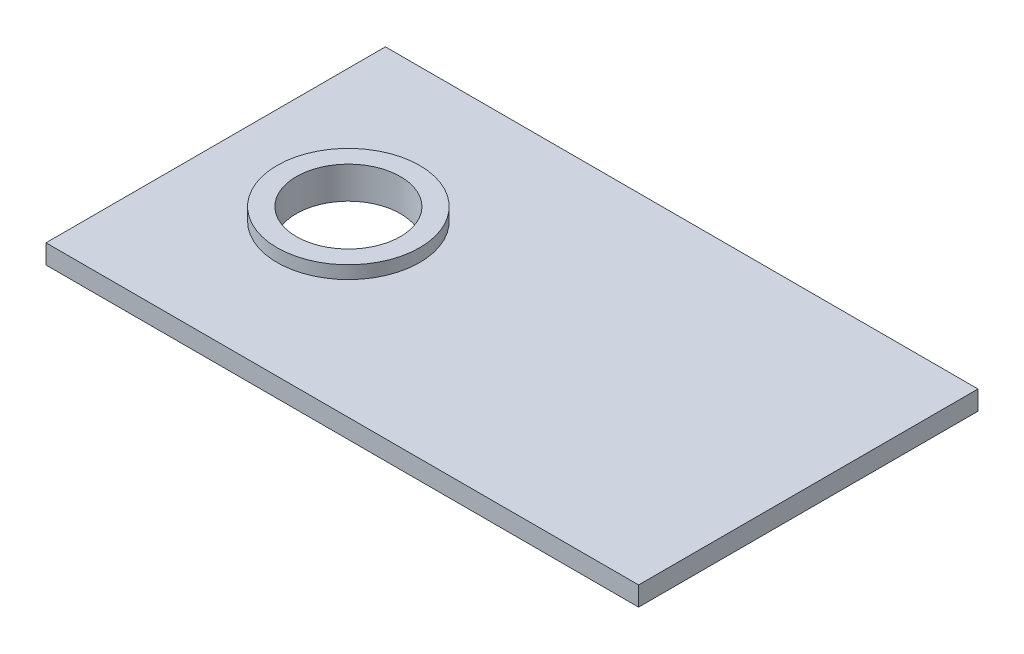
ISO-10303-21;
HEADER;
FILE_DESCRIPTION(('STEP AP214'),'2;1');
FILE_NAME('part.step','',(''),(''),'','','');
FILE_SCHEMA(('AUTOMOTIVE_DESIGN { 1 0 10303 214 1 1 1 1 }'));
ENDSEC;
DATA;
#1=APPLICATION_CONTEXT('core data for automotive mechanical design processes');
#2=APPLICATION_PROTOCOL_DEFINITION('international standard','automotive_design',2000,#1);
#3=PRODUCT_CONTEXT('',#1,'mechanical');
#4=PRODUCT('Part','Part','',(#3));
#5=PRODUCT_RELATED_PRODUCT_CATEGORY('part','',(#4));
#6=PRODUCT_DEFINITION_FORMATION('','',#4);
#7=PRODUCT_DEFINITION_CONTEXT('part definition',#1,'design');
#8=PRODUCT_DEFINITION('design','',#6,#7);
#9=PRODUCT_DEFINITION_SHAPE('','',#8);
#10=(LENGTH_UNIT() NAMED_UNIT(*) SI_UNIT(.MILLI.,.METRE.));
#11=(NAMED_UNIT(*) PLANE_ANGLE_UNIT() SI_UNIT($,.RADIAN.));
#12=(NAMED_UNIT(*) SI_UNIT($,.STERADIAN.) SOLID_ANGLE_UNIT());
#13=UNCERTAINTY_MEASURE_WITH_UNIT(LENGTH_MEASURE(1.E-05),#10,'distance_accuracy_value','');
#14=(GEOMETRIC_REPRESENTATION_CONTEXT(3) GLOBAL_UNCERTAINTY_ASSIGNED_CONTEXT((#13)) GLOBAL_UNIT_ASSIGNED_CONTEXT((#10,
#11,#12)) REPRESENTATION_CONTEXT('',''));
#15=CARTESIAN_POINT('',(0.,0.,0.));
#16=DIRECTION('',(0.,0.,1.));
#17=DIRECTION('',(1.,0.,0.));
#18=AXIS2_PLACEMENT_3D('',#15,#16,#17);
#19=CARTESIAN_POINT('',(0.,3.,0.));
#20=DIRECTION('',(0.,-1.,0.));
#21=DIRECTION('',(0.,0.,-1.));
#22=AXIS2_PLACEMENT_3D('',#19,#20,#21);
#23=PLANE('',#22);
#24=DIRECTION('',(0.,0.,-1.));
#25=VECTOR('',#24,1.);
#26=CARTESIAN_POINT('',(46.1263570139865,3.,26.417822653465));
#27=LINE('',#26,#25);
#28=CARTESIAN_POINT('',(46.1263570139865,3.,26.417822653465));
#29=VERTEX_POINT('',#28);
#30=CARTESIAN_POINT('',(46.1263570139865,3.,-26.417822653465));
#31=VERTEX_POINT('',#30);
#32=EDGE_CURVE('E86',#29,#31,#27,.T.);
#33=ORIENTED_EDGE('',*,*,#32,.T.);
#34=DIRECTION('',(-1.,0.,0.));
#35=VECTOR('',#34,1.);
#36=CARTESIAN_POINT('',(-46.1263570139865,3.,-26.417822653465));
#37=LINE('',#36,#35);
#38=CARTESIAN_POINT('',(-46.1263570139865,3.,-26.417822653465));
#39=VERTEX_POINT('',#38);
#40=EDGE_CURVE('E81',#31,#39,#37,.T.);
#41=ORIENTED_EDGE('',*,*,#40,.T.);
#42=DIRECTION('',(0.,0.,1.));
#43=VECTOR('',#42,1.);
#44=CARTESIAN_POINT('',(-46.1263570139865,3.,26.417822653465));
#45=LINE('',#44,#43);
#46=CARTESIAN_POINT('',(-46.1263570139865,3.,26.417822653465));
#47=VERTEX_POINT('',#46);
#48=EDGE_CURVE('E84',#39,#47,#45,.T.);
#49=ORIENTED_EDGE('',*,*,#48,.T.);
#50=DIRECTION('',(1.,0.,0.));
#51=VECTOR('',#50,1.);
#52=CARTESIAN_POINT('',(-46.1263570139865,3.,26.417822653465));
#53=LINE('',#52,#51);
#54=EDGE_CURVE('E50',#47,#29,#53,.T.);
#55=ORIENTED_EDGE('',*,*,#54,.T.);
#56=EDGE_LOOP('',(#33,#41,#49,#55));
#57=FACE_BOUND('',#56,.T.);
#58=CARTESIAN_POINT('',(-25.4709981920845,3.,0.));
#59=DIRECTION('',(0.,-1.,0.));
#60=DIRECTION('',(0.,0.,-1.));
#61=AXIS2_PLACEMENT_3D('',#58,#59,#60);
#62=CIRCLE('',#61,11.1);
#63=CARTESIAN_POINT('',(-25.4709981920845,3.,-11.1));
#64=VERTEX_POINT('',#63);
#65=EDGE_CURVE('E11',#64,#64,#62,.F.);
#66=ORIENTED_EDGE('',*,*,#65,.F.);
#67=EDGE_LOOP('',(#66));
#68=FACE_BOUND('',#67,.T.);
#69=ADVANCED_FACE('F33',(#57,#68),#23,.F.);
#70=CARTESIAN_POINT('',(0.,0.,0.));
#71=DIRECTION('',(0.,-1.,0.));
#72=DIRECTION('',(0.,0.,-1.));
#73=AXIS2_PLACEMENT_3D('',#70,#71,#72);
#74=PLANE('',#73);
#75=DIRECTION('',(0.,0.,-1.));
#76=VECTOR('',#75,1.);
#77=CARTESIAN_POINT('',(46.1263570139865,0.,26.417822653465));
#78=LINE('',#77,#76);
#79=CARTESIAN_POINT('',(46.1263570139865,0.,26.417822653465));
#80=VERTEX_POINT('',#79);
#81=CARTESIAN_POINT('',(46.1263570139865,0.,-26.417822653465));
#82=VERTEX_POINT('',#81);
#83=EDGE_CURVE('E100',#80,#82,#78,.T.);
#84=ORIENTED_EDGE('',*,*,#83,.F.);
#85=DIRECTION('',(1.,0.,0.));
#86=VECTOR('',#85,1.);
#87=CARTESIAN_POINT('',(-46.1263570139865,0.,26.417822653465));
#88=LINE('',#87,#86);
#89=CARTESIAN_POINT('',(-46.1263570139865,0.,26.417822653465));
#90=VERTEX_POINT('',#89);
#91=EDGE_CURVE('E73',#90,#80,#88,.T.);
#92=ORIENTED_EDGE('',*,*,#91,.F.);
#93=DIRECTION('',(0.,0.,1.));
#94=VECTOR('',#93,1.);
#95=CARTESIAN_POINT('',(-46.1263570139865,0.,26.417822653465));
#96=LINE('',#95,#94);
#97=CARTESIAN_POINT('',(-46.1263570139865,0.,-26.417822653465));
#98=VERTEX_POINT('',#97);
#99=EDGE_CURVE('E67',#98,#90,#96,.T.);
#100=ORIENTED_EDGE('',*,*,#99,.F.);
#101=DIRECTION('',(-1.,0.,0.));
#102=VECTOR('',#101,1.);
#103=CARTESIAN_POINT('',(-46.1263570139865,0.,-26.417822653465));
#104=LINE('',#103,#102);
#105=EDGE_CURVE('E91',#82,#98,#104,.T.);
#106=ORIENTED_EDGE('',*,*,#105,.F.);
#107=EDGE_LOOP('',(#84,#92,#100,#106));
#108=FACE_BOUND('',#107,.T.);
#109=CARTESIAN_POINT('',(-25.4709981920845,0.,0.));
#110=DIRECTION('',(0.,1.,0.));
#111=DIRECTION('',(0.,0.,1.));
#112=AXIS2_PLACEMENT_3D('',#109,#110,#111);
#113=CIRCLE('',#112,8.1);
#114=CARTESIAN_POINT('',(-25.4709981920845,0.,8.1));
#115=VERTEX_POINT('',#114);
#116=EDGE_CURVE('E103',#115,#115,#113,.T.);
#117=ORIENTED_EDGE('',*,*,#116,.T.);
#118=EDGE_LOOP('',(#117));
#119=FACE_BOUND('',#118,.T.);
#120=ADVANCED_FACE('F111',(#108,#119),#74,.T.);
#121=CARTESIAN_POINT('',(46.1263570139865,3.,26.417822653465));
#122=DIRECTION('',(-1.,0.,0.));
#123=DIRECTION('',(0.,0.,1.));
#124=AXIS2_PLACEMENT_3D('',#121,#122,#123);
#125=PLANE('',#124);
#126=ORIENTED_EDGE('',*,*,#83,.T.);
#127=DIRECTION('',(0.,-1.,0.));
#128=VECTOR('',#127,1.);
#129=CARTESIAN_POINT('',(46.1263570139865,3.,-26.417822653465));
#130=LINE('',#129,#128);
#131=EDGE_CURVE('E42',#31,#82,#130,.T.);
#132=ORIENTED_EDGE('',*,*,#131,.F.);
#133=ORIENTED_EDGE('',*,*,#32,.F.);
#134=DIRECTION('',(0.,-1.,0.));
#135=VECTOR('',#134,1.);
#136=CARTESIAN_POINT('',(46.1263570139865,3.,26.417822653465));
#137=LINE('',#136,#135);
#138=EDGE_CURVE('E96',#29,#80,#137,.T.);
#139=ORIENTED_EDGE('',*,*,#138,.T.);
#140=EDGE_LOOP('',(#126,#132,#133,#139));
#141=FACE_BOUND('',#140,.T.);
#142=ADVANCED_FACE('F35',(#141),#125,.F.);
#143=CARTESIAN_POINT('',(-46.1263570139865,3.,-26.417822653465));
#144=DIRECTION('',(0.,0.,1.));
#145=DIRECTION('',(1.,0.,0.));
#146=AXIS2_PLACEMENT_3D('',#143,#144,#145);
#147=PLANE('',#146);
#148=ORIENTED_EDGE('',*,*,#105,.T.);
#149=DIRECTION('',(0.,-1.,0.));
#150=VECTOR('',#149,1.);
#151=CARTESIAN_POINT('',(-46.1263570139865,3.,-26.417822653465));
#152=LINE('',#151,#150);
#153=EDGE_CURVE('E89',#39,#98,#152,.T.);
#154=ORIENTED_EDGE('',*,*,#153,.F.);
#155=ORIENTED_EDGE('',*,*,#40,.F.);
#156=ORIENTED_EDGE('',*,*,#131,.T.);
#157=EDGE_LOOP('',(#148,#154,#155,#156));
#158=FACE_BOUND('',#157,.T.);
#159=ADVANCED_FACE('F90',(#158),#147,.F.);
#160=CARTESIAN_POINT('',(-46.1263570139865,3.,26.417822653465));
#161=DIRECTION('',(1.,0.,0.));
#162=DIRECTION('',(0.,0.,-1.));
#163=AXIS2_PLACEMENT_3D('',#160,#161,#162);
#164=PLANE('',#163);
#165=ORIENTED_EDGE('',*,*,#99,.T.);
#166=DIRECTION('',(0.,-1.,0.));
#167=VECTOR('',#166,1.);
#168=CARTESIAN_POINT('',(-46.1263570139865,3.,26.417822653465));
#169=LINE('',#168,#167);
#170=EDGE_CURVE('E92',#47,#90,#169,.T.);
#171=ORIENTED_EDGE('',*,*,#170,.F.);
#172=ORIENTED_EDGE('',*,*,#48,.F.);
#173=ORIENTED_EDGE('',*,*,#153,.T.);
#174=EDGE_LOOP('',(#165,#171,#172,#173));
#175=FACE_BOUND('',#174,.T.);
#176=ADVANCED_FACE('F94',(#175),#164,.F.);
#177=CARTESIAN_POINT('',(-46.1263570139865,3.,26.417822653465));
#178=DIRECTION('',(0.,0.,-1.));
#179=DIRECTION('',(-1.,0.,0.));
#180=AXIS2_PLACEMENT_3D('',#177,#178,#179);
#181=PLANE('',#180);
#182=ORIENTED_EDGE('',*,*,#91,.T.);
#183=ORIENTED_EDGE('',*,*,#138,.F.);
#184=ORIENTED_EDGE('',*,*,#54,.F.);
#185=ORIENTED_EDGE('',*,*,#170,.T.);
#186=EDGE_LOOP('',(#182,#183,#184,#185));
#187=FACE_BOUND('',#186,.T.);
#188=ADVANCED_FACE('F140',(#187),#181,.F.);
#189=CARTESIAN_POINT('',(-25.4709981920845,3.,0.));
#190=DIRECTION('',(0.,-1.,0.));
#191=DIRECTION('',(0.,0.,-1.));
#192=AXIS2_PLACEMENT_3D('',#189,#190,#191);
#193=CYLINDRICAL_SURFACE('',#192,8.1);
#194=ORIENTED_EDGE('',*,*,#116,.F.);
#195=EDGE_LOOP('',(#194));
#196=FACE_BOUND('',#195,.T.);
#197=CARTESIAN_POINT('',(-25.4709981920845,5.,0.));
#198=DIRECTION('',(0.,1.,0.));
#199=DIRECTION('',(0.,0.,1.));
#200=AXIS2_PLACEMENT_3D('',#197,#198,#199);
#201=CIRCLE('',#200,8.1);
#202=CARTESIAN_POINT('',(-25.4709981920845,5.,8.1));
#203=VERTEX_POINT('',#202);
#204=EDGE_CURVE('E121',#203,#203,#201,.T.);
#205=ORIENTED_EDGE('',*,*,#204,.T.);
#206=EDGE_LOOP('',(#205));
#207=FACE_BOUND('',#206,.T.);
#208=ADVANCED_FACE('F127',(#196,#207),#193,.F.);
#209=CARTESIAN_POINT('',(-25.4709981920845,5.,0.));
#210=DIRECTION('',(0.,1.,0.));
#211=DIRECTION('',(0.,0.,1.));
#212=AXIS2_PLACEMENT_3D('',#209,#210,#211);
#213=PLANE('',#212);
#214=CARTESIAN_POINT('',(-25.4709981920845,5.,0.));
#215=DIRECTION('',(0.,1.,0.));
#216=DIRECTION('',(0.,0.,1.));
#217=AXIS2_PLACEMENT_3D('',#214,#215,#216);
#218=CIRCLE('',#217,11.1);
#219=CARTESIAN_POINT('',(-25.4709981920845,5.,11.1));
#220=VERTEX_POINT('',#219);
#221=EDGE_CURVE('E118',#220,#220,#218,.T.);
#222=ORIENTED_EDGE('',*,*,#221,.T.);
#223=EDGE_LOOP('',(#222));
#224=FACE_BOUND('',#223,.T.);
#225=ORIENTED_EDGE('',*,*,#204,.F.);
#226=EDGE_LOOP('',(#225));
#227=FACE_BOUND('',#226,.T.);
#228=ADVANCED_FACE('F129',(#224,#227),#213,.T.);
#229=CARTESIAN_POINT('',(-25.4709981920845,5.,0.));
#230=DIRECTION('',(0.,-1.,0.));
#231=DIRECTION('',(0.,0.,-1.));
#232=AXIS2_PLACEMENT_3D('',#229,#230,#231);
#233=CYLINDRICAL_SURFACE('',#232,11.1);
#234=ORIENTED_EDGE('',*,*,#221,.F.);
#235=EDGE_LOOP('',(#234));
#236=FACE_BOUND('',#235,.T.);
#237=ORIENTED_EDGE('',*,*,#65,.T.);
#238=EDGE_LOOP('',(#237));
#239=FACE_BOUND('',#238,.T.);
#240=ADVANCED_FACE('F131',(#236,#239),#233,.T.);
#241=CLOSED_SHELL('',(#69,#120,#142,#159,#176,#188,#208,#228,#240));
#242=MANIFOLD_SOLID_BREP('B2',#241);
#243=ADVANCED_BREP_SHAPE_REPRESENTATION('',(#18,#242),#14);
#244=SHAPE_DEFINITION_REPRESENTATION(#9,#243);
ENDSEC;
END-ISO-10303-21;
